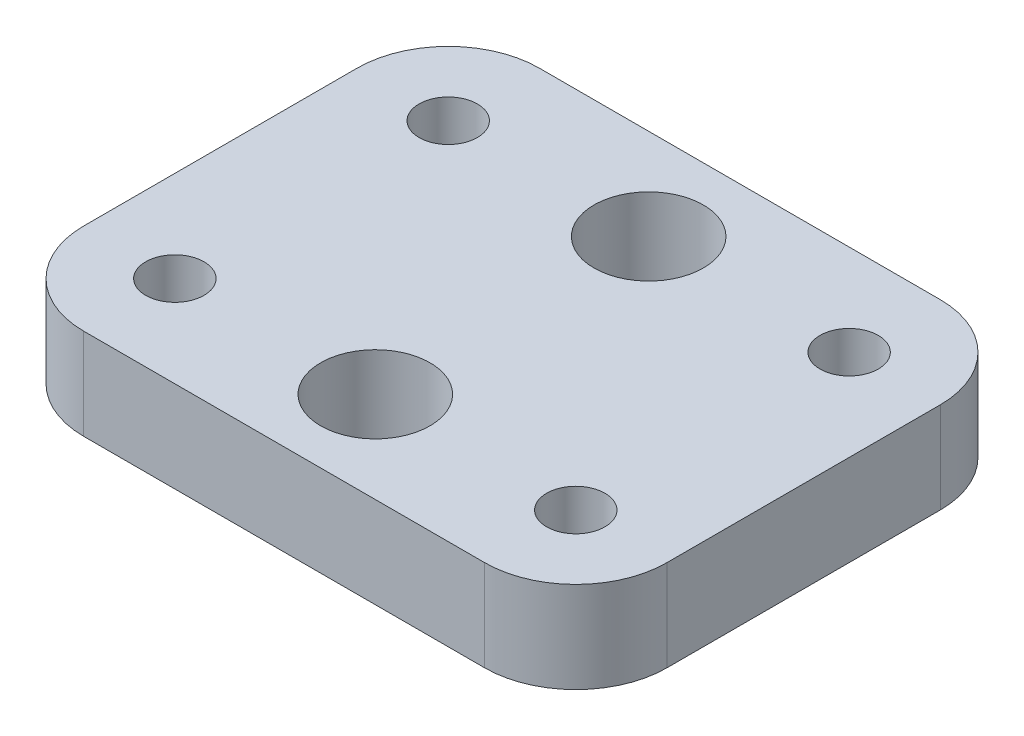
ISO-10303-21;
HEADER;
FILE_DESCRIPTION(('STEP AP214'),'2;1');
FILE_NAME('part.step','',(''),(''),'','','');
FILE_SCHEMA(('AUTOMOTIVE_DESIGN { 1 0 10303 214 1 1 1 1 }'));
ENDSEC;
DATA;
#1=APPLICATION_CONTEXT('core data for automotive mechanical design processes');
#2=APPLICATION_PROTOCOL_DEFINITION('international standard','automotive_design',2000,#1);
#3=PRODUCT_CONTEXT('',#1,'mechanical');
#4=PRODUCT('Part','Part','',(#3));
#5=PRODUCT_RELATED_PRODUCT_CATEGORY('part','',(#4));
#6=PRODUCT_DEFINITION_FORMATION('','',#4);
#7=PRODUCT_DEFINITION_CONTEXT('part definition',#1,'design');
#8=PRODUCT_DEFINITION('design','',#6,#7);
#9=PRODUCT_DEFINITION_SHAPE('','',#8);
#10=(LENGTH_UNIT() NAMED_UNIT(*) SI_UNIT(.MILLI.,.METRE.));
#11=(NAMED_UNIT(*) PLANE_ANGLE_UNIT() SI_UNIT($,.RADIAN.));
#12=(NAMED_UNIT(*) SI_UNIT($,.STERADIAN.) SOLID_ANGLE_UNIT());
#13=UNCERTAINTY_MEASURE_WITH_UNIT(LENGTH_MEASURE(1.E-05),#10,'distance_accuracy_value','');
#14=(GEOMETRIC_REPRESENTATION_CONTEXT(3) GLOBAL_UNCERTAINTY_ASSIGNED_CONTEXT((#13)) GLOBAL_UNIT_ASSIGNED_CONTEXT((#10,
#11,#12)) REPRESENTATION_CONTEXT('',''));
#15=CARTESIAN_POINT('',(0.,0.,0.));
#16=DIRECTION('',(0.,0.,1.));
#17=DIRECTION('',(1.,0.,0.));
#18=AXIS2_PLACEMENT_3D('',#15,#16,#17);
#19=CARTESIAN_POINT('',(0.,18.,0.));
#20=DIRECTION('',(0.,0.,-1.));
#21=DIRECTION('',(-1.,0.,0.));
#22=AXIS2_PLACEMENT_3D('',#19,#20,#21);
#23=PLANE('',#22);
#24=DIRECTION('',(0.,-1.,0.));
#25=VECTOR('',#24,1.);
#26=CARTESIAN_POINT('',(5.,0.,0.));
#27=LINE('',#26,#25);
#28=CARTESIAN_POINT('',(5.,19.,0.));
#29=VERTEX_POINT('',#28);
#30=CARTESIAN_POINT('',(5.,14.,0.));
#31=VERTEX_POINT('',#30);
#32=EDGE_CURVE('E50',#29,#31,#27,.T.);
#33=ORIENTED_EDGE('',*,*,#32,.T.);
#34=DIRECTION('',(1.,0.,0.));
#35=VECTOR('',#34,1.);
#36=CARTESIAN_POINT('',(0.,14.,0.));
#37=LINE('',#36,#35);
#38=CARTESIAN_POINT('',(27.,14.,0.));
#39=VERTEX_POINT('',#38);
#40=EDGE_CURVE('E113',#31,#39,#37,.T.);
#41=ORIENTED_EDGE('',*,*,#40,.T.);
#42=DIRECTION('',(0.,-1.,0.));
#43=VECTOR('',#42,1.);
#44=CARTESIAN_POINT('',(27.,18.,0.));
#45=LINE('',#44,#43);
#46=CARTESIAN_POINT('',(27.,19.,0.));
#47=VERTEX_POINT('',#46);
#48=EDGE_CURVE('E11',#39,#47,#45,.F.);
#49=ORIENTED_EDGE('',*,*,#48,.T.);
#50=DIRECTION('',(1.,0.,0.));
#51=VECTOR('',#50,1.);
#52=CARTESIAN_POINT('',(0.,19.,0.));
#53=LINE('',#52,#51);
#54=EDGE_CURVE('E132',#29,#47,#53,.T.);
#55=ORIENTED_EDGE('',*,*,#54,.F.);
#56=EDGE_LOOP('',(#33,#41,#49,#55));
#57=FACE_BOUND('',#56,.T.);
#58=ADVANCED_FACE('F40',(#57),#23,.F.);
#59=CARTESIAN_POINT('',(0.,19.,0.));
#60=DIRECTION('',(0.,-1.,0.));
#61=DIRECTION('',(0.,0.,-1.));
#62=AXIS2_PLACEMENT_3D('',#59,#60,#61);
#63=PLANE('',#62);
#64=CARTESIAN_POINT('',(16.,19.,-20.));
#65=DIRECTION('',(0.,1.,0.));
#66=DIRECTION('',(0.,0.,1.));
#67=AXIS2_PLACEMENT_3D('',#64,#65,#66);
#68=CIRCLE('',#67,3.);
#69=CARTESIAN_POINT('',(16.,19.,-17.));
#70=VERTEX_POINT('',#69);
#71=EDGE_CURVE('E168',#70,#70,#68,.T.);
#72=ORIENTED_EDGE('',*,*,#71,.F.);
#73=EDGE_LOOP('',(#72));
#74=FACE_BOUND('',#73,.T.);
#75=CARTESIAN_POINT('',(16.,19.,-5.));
#76=DIRECTION('',(0.,1.,0.));
#77=DIRECTION('',(0.,0.,1.));
#78=AXIS2_PLACEMENT_3D('',#75,#76,#77);
#79=CIRCLE('',#78,3.);
#80=CARTESIAN_POINT('',(16.,19.,-2.));
#81=VERTEX_POINT('',#80);
#82=EDGE_CURVE('E176',#81,#81,#79,.T.);
#83=ORIENTED_EDGE('',*,*,#82,.F.);
#84=EDGE_LOOP('',(#83));
#85=FACE_BOUND('',#84,.T.);
#86=CARTESIAN_POINT('',(27.,19.,-20.));
#87=DIRECTION('',(0.,1.,0.));
#88=DIRECTION('',(0.,0.,1.));
#89=AXIS2_PLACEMENT_3D('',#86,#87,#88);
#90=CIRCLE('',#89,1.6);
#91=CARTESIAN_POINT('',(27.,19.,-18.4));
#92=VERTEX_POINT('',#91);
#93=EDGE_CURVE('E174',#92,#92,#90,.T.);
#94=ORIENTED_EDGE('',*,*,#93,.F.);
#95=EDGE_LOOP('',(#94));
#96=FACE_BOUND('',#95,.T.);
#97=CARTESIAN_POINT('',(27.,19.,-5.));
#98=DIRECTION('',(0.,1.,0.));
#99=DIRECTION('',(0.,0.,1.));
#100=AXIS2_PLACEMENT_3D('',#97,#98,#99);
#101=CIRCLE('',#100,1.6);
#102=CARTESIAN_POINT('',(27.,19.,-3.4));
#103=VERTEX_POINT('',#102);
#104=EDGE_CURVE('E188',#103,#103,#101,.T.);
#105=ORIENTED_EDGE('',*,*,#104,.F.);
#106=EDGE_LOOP('',(#105));
#107=FACE_BOUND('',#106,.T.);
#108=CARTESIAN_POINT('',(5.,19.,-5.));
#109=DIRECTION('',(0.,1.,0.));
#110=DIRECTION('',(0.,0.,1.));
#111=AXIS2_PLACEMENT_3D('',#108,#109,#110);
#112=CIRCLE('',#111,1.6);
#113=CARTESIAN_POINT('',(5.,19.,-3.4));
#114=VERTEX_POINT('',#113);
#115=EDGE_CURVE('E184',#114,#114,#112,.T.);
#116=ORIENTED_EDGE('',*,*,#115,.F.);
#117=EDGE_LOOP('',(#116));
#118=FACE_BOUND('',#117,.T.);
#119=CARTESIAN_POINT('',(5.,19.,-20.));
#120=DIRECTION('',(0.,1.,0.));
#121=DIRECTION('',(0.,0.,1.));
#122=AXIS2_PLACEMENT_3D('',#119,#120,#121);
#123=CIRCLE('',#122,1.6);
#124=CARTESIAN_POINT('',(5.,19.,-18.4));
#125=VERTEX_POINT('',#124);
#126=EDGE_CURVE('E155',#125,#125,#123,.T.);
#127=ORIENTED_EDGE('',*,*,#126,.F.);
#128=EDGE_LOOP('',(#127));
#129=FACE_BOUND('',#128,.T.);
#130=DIRECTION('',(0.,0.,-1.));
#131=VECTOR('',#130,1.);
#132=CARTESIAN_POINT('',(0.,19.,0.));
#133=LINE('',#132,#131);
#134=CARTESIAN_POINT('',(0.,19.,-5.));
#135=VERTEX_POINT('',#134);
#136=CARTESIAN_POINT('',(0.,19.,-20.));
#137=VERTEX_POINT('',#136);
#138=EDGE_CURVE('E208',#135,#137,#133,.T.);
#139=ORIENTED_EDGE('',*,*,#138,.F.);
#140=CARTESIAN_POINT('',(5.,19.,-5.));
#141=DIRECTION('',(0.,-1.,0.));
#142=DIRECTION('',(0.,0.,-1.));
#143=AXIS2_PLACEMENT_3D('',#140,#141,#142);
#144=CIRCLE('',#143,5.);
#145=EDGE_CURVE('E63',#135,#29,#144,.F.);
#146=ORIENTED_EDGE('',*,*,#145,.T.);
#147=ORIENTED_EDGE('',*,*,#54,.T.);
#148=CARTESIAN_POINT('',(27.,19.,-5.));
#149=DIRECTION('',(0.,-1.,0.));
#150=DIRECTION('',(0.,0.,-1.));
#151=AXIS2_PLACEMENT_3D('',#148,#149,#150);
#152=CIRCLE('',#151,5.);
#153=CARTESIAN_POINT('',(32.,19.,-5.));
#154=VERTEX_POINT('',#153);
#155=EDGE_CURVE('E136',#47,#154,#152,.F.);
#156=ORIENTED_EDGE('',*,*,#155,.T.);
#157=DIRECTION('',(0.,0.,1.));
#158=VECTOR('',#157,1.);
#159=CARTESIAN_POINT('',(32.,19.,0.));
#160=LINE('',#159,#158);
#161=CARTESIAN_POINT('',(32.,19.,-20.));
#162=VERTEX_POINT('',#161);
#163=EDGE_CURVE('E203',#162,#154,#160,.T.);
#164=ORIENTED_EDGE('',*,*,#163,.F.);
#165=CARTESIAN_POINT('',(27.,19.,-20.));
#166=DIRECTION('',(0.,1.,0.));
#167=DIRECTION('',(0.,0.,1.));
#168=AXIS2_PLACEMENT_3D('',#165,#166,#167);
#169=CIRCLE('',#168,5.);
#170=CARTESIAN_POINT('',(27.,19.,-25.));
#171=VERTEX_POINT('',#170);
#172=EDGE_CURVE('E219',#162,#171,#169,.T.);
#173=ORIENTED_EDGE('',*,*,#172,.T.);
#174=DIRECTION('',(1.,0.,0.));
#175=VECTOR('',#174,1.);
#176=CARTESIAN_POINT('',(0.,19.,-25.));
#177=LINE('',#176,#175);
#178=CARTESIAN_POINT('',(5.,19.,-25.));
#179=VERTEX_POINT('',#178);
#180=EDGE_CURVE('E223',#179,#171,#177,.T.);
#181=ORIENTED_EDGE('',*,*,#180,.F.);
#182=CARTESIAN_POINT('',(5.,19.,-20.));
#183=DIRECTION('',(0.,1.,0.));
#184=DIRECTION('',(0.,0.,1.));
#185=AXIS2_PLACEMENT_3D('',#182,#183,#184);
#186=CIRCLE('',#185,5.);
#187=EDGE_CURVE('E227',#179,#137,#186,.T.);
#188=ORIENTED_EDGE('',*,*,#187,.T.);
#189=EDGE_LOOP('',(#139,#146,#147,#156,#164,#173,#181,#188));
#190=FACE_BOUND('',#189,.T.);
#191=ADVANCED_FACE('F248',(#74,#85,#96,#107,#118,#129,#190),#63,.F.);
#192=CARTESIAN_POINT('',(27.,18.,-5.));
#193=DIRECTION('',(0.,-1.,0.));
#194=DIRECTION('',(0.,0.,-1.));
#195=AXIS2_PLACEMENT_3D('',#192,#193,#194);
#196=CYLINDRICAL_SURFACE('',#195,5.);
#197=CARTESIAN_POINT('',(27.,14.,-5.));
#198=DIRECTION('',(0.,1.,0.));
#199=DIRECTION('',(0.,0.,1.));
#200=AXIS2_PLACEMENT_3D('',#197,#198,#199);
#201=CIRCLE('',#200,5.);
#202=CARTESIAN_POINT('',(32.,14.,-5.));
#203=VERTEX_POINT('',#202);
#204=EDGE_CURVE('E200',#203,#39,#201,.F.);
#205=ORIENTED_EDGE('',*,*,#204,.F.);
#206=DIRECTION('',(0.,-1.,0.));
#207=VECTOR('',#206,1.);
#208=CARTESIAN_POINT('',(32.,18.,-5.));
#209=LINE('',#208,#207);
#210=EDGE_CURVE('E138',#154,#203,#209,.T.);
#211=ORIENTED_EDGE('',*,*,#210,.F.);
#212=ORIENTED_EDGE('',*,*,#155,.F.);
#213=ORIENTED_EDGE('',*,*,#48,.F.);
#214=EDGE_LOOP('',(#205,#211,#212,#213));
#215=FACE_BOUND('',#214,.T.);
#216=ADVANCED_FACE('F262',(#215),#196,.T.);
#217=CARTESIAN_POINT('',(5.,18.,-5.));
#218=DIRECTION('',(0.,1.,0.));
#219=DIRECTION('',(0.,0.,1.));
#220=AXIS2_PLACEMENT_3D('',#217,#218,#219);
#221=CYLINDRICAL_SURFACE('',#220,5.);
#222=CARTESIAN_POINT('',(5.,14.,-5.));
#223=DIRECTION('',(0.,1.,0.));
#224=DIRECTION('',(0.,0.,1.));
#225=AXIS2_PLACEMENT_3D('',#222,#223,#224);
#226=CIRCLE('',#225,5.);
#227=CARTESIAN_POINT('',(0.,14.,-5.));
#228=VERTEX_POINT('',#227);
#229=EDGE_CURVE('E107',#31,#228,#226,.F.);
#230=ORIENTED_EDGE('',*,*,#229,.F.);
#231=ORIENTED_EDGE('',*,*,#32,.F.);
#232=ORIENTED_EDGE('',*,*,#145,.F.);
#233=DIRECTION('',(0.,-1.,0.));
#234=VECTOR('',#233,1.);
#235=CARTESIAN_POINT('',(0.,18.,-5.));
#236=LINE('',#235,#234);
#237=EDGE_CURVE('E124',#135,#228,#236,.T.);
#238=ORIENTED_EDGE('',*,*,#237,.T.);
#239=EDGE_LOOP('',(#230,#231,#232,#238));
#240=FACE_BOUND('',#239,.T.);
#241=ADVANCED_FACE('F42',(#240),#221,.T.);
#242=CARTESIAN_POINT('',(32.,14.,0.));
#243=DIRECTION('',(-1.,0.,0.));
#244=DIRECTION('',(0.,0.,1.));
#245=AXIS2_PLACEMENT_3D('',#242,#243,#244);
#246=PLANE('',#245);
#247=ORIENTED_EDGE('',*,*,#163,.T.);
#248=ORIENTED_EDGE('',*,*,#210,.T.);
#249=DIRECTION('',(0.,0.,1.));
#250=VECTOR('',#249,1.);
#251=CARTESIAN_POINT('',(32.,14.,0.));
#252=LINE('',#251,#250);
#253=CARTESIAN_POINT('',(32.,14.,-20.));
#254=VERTEX_POINT('',#253);
#255=EDGE_CURVE('E204',#254,#203,#252,.T.);
#256=ORIENTED_EDGE('',*,*,#255,.F.);
#257=DIRECTION('',(0.,1.,0.));
#258=VECTOR('',#257,1.);
#259=CARTESIAN_POINT('',(32.,14.,-20.));
#260=LINE('',#259,#258);
#261=EDGE_CURVE('E128',#254,#162,#260,.T.);
#262=ORIENTED_EDGE('',*,*,#261,.T.);
#263=EDGE_LOOP('',(#247,#248,#256,#262));
#264=FACE_BOUND('',#263,.T.);
#265=ADVANCED_FACE('F244',(#264),#246,.F.);
#266=CARTESIAN_POINT('',(0.,14.,0.));
#267=DIRECTION('',(1.,0.,0.));
#268=DIRECTION('',(0.,0.,-1.));
#269=AXIS2_PLACEMENT_3D('',#266,#267,#268);
#270=PLANE('',#269);
#271=ORIENTED_EDGE('',*,*,#138,.T.);
#272=DIRECTION('',(0.,1.,0.));
#273=VECTOR('',#272,1.);
#274=CARTESIAN_POINT('',(0.,14.,-20.));
#275=LINE('',#274,#273);
#276=CARTESIAN_POINT('',(0.,14.,-20.));
#277=VERTEX_POINT('',#276);
#278=EDGE_CURVE('E125',#277,#137,#275,.T.);
#279=ORIENTED_EDGE('',*,*,#278,.F.);
#280=DIRECTION('',(0.,0.,-1.));
#281=VECTOR('',#280,1.);
#282=CARTESIAN_POINT('',(0.,14.,0.));
#283=LINE('',#282,#281);
#284=EDGE_CURVE('E111',#228,#277,#283,.T.);
#285=ORIENTED_EDGE('',*,*,#284,.F.);
#286=ORIENTED_EDGE('',*,*,#237,.F.);
#287=EDGE_LOOP('',(#271,#279,#285,#286));
#288=FACE_BOUND('',#287,.T.);
#289=ADVANCED_FACE('F123',(#288),#270,.F.);
#290=CARTESIAN_POINT('',(5.,14.,-20.));
#291=DIRECTION('',(0.,1.,0.));
#292=DIRECTION('',(0.,0.,1.));
#293=AXIS2_PLACEMENT_3D('',#290,#291,#292);
#294=CYLINDRICAL_SURFACE('',#293,5.);
#295=ORIENTED_EDGE('',*,*,#187,.F.);
#296=DIRECTION('',(0.,1.,0.));
#297=VECTOR('',#296,1.);
#298=CARTESIAN_POINT('',(5.,14.,-25.));
#299=LINE('',#298,#297);
#300=CARTESIAN_POINT('',(5.,14.,-25.));
#301=VERTEX_POINT('',#300);
#302=EDGE_CURVE('E235',#301,#179,#299,.T.);
#303=ORIENTED_EDGE('',*,*,#302,.F.);
#304=CARTESIAN_POINT('',(5.,14.,-20.));
#305=DIRECTION('',(0.,1.,0.));
#306=DIRECTION('',(0.,0.,1.));
#307=AXIS2_PLACEMENT_3D('',#304,#305,#306);
#308=CIRCLE('',#307,5.);
#309=EDGE_CURVE('E129',#301,#277,#308,.T.);
#310=ORIENTED_EDGE('',*,*,#309,.T.);
#311=ORIENTED_EDGE('',*,*,#278,.T.);
#312=EDGE_LOOP('',(#295,#303,#310,#311));
#313=FACE_BOUND('',#312,.T.);
#314=ADVANCED_FACE('F259',(#313),#294,.T.);
#315=CARTESIAN_POINT('',(0.,14.,-25.));
#316=DIRECTION('',(0.,0.,1.));
#317=DIRECTION('',(1.,0.,0.));
#318=AXIS2_PLACEMENT_3D('',#315,#316,#317);
#319=PLANE('',#318);
#320=ORIENTED_EDGE('',*,*,#180,.T.);
#321=DIRECTION('',(0.,1.,0.));
#322=VECTOR('',#321,1.);
#323=CARTESIAN_POINT('',(27.,14.,-25.));
#324=LINE('',#323,#322);
#325=CARTESIAN_POINT('',(27.,14.,-25.));
#326=VERTEX_POINT('',#325);
#327=EDGE_CURVE('E238',#326,#171,#324,.T.);
#328=ORIENTED_EDGE('',*,*,#327,.F.);
#329=DIRECTION('',(1.,0.,0.));
#330=VECTOR('',#329,1.);
#331=CARTESIAN_POINT('',(0.,14.,-25.));
#332=LINE('',#331,#330);
#333=EDGE_CURVE('E212',#301,#326,#332,.T.);
#334=ORIENTED_EDGE('',*,*,#333,.F.);
#335=ORIENTED_EDGE('',*,*,#302,.T.);
#336=EDGE_LOOP('',(#320,#328,#334,#335));
#337=FACE_BOUND('',#336,.T.);
#338=ADVANCED_FACE('F256',(#337),#319,.F.);
#339=CARTESIAN_POINT('',(27.,14.,-20.));
#340=DIRECTION('',(0.,1.,0.));
#341=DIRECTION('',(0.,0.,1.));
#342=AXIS2_PLACEMENT_3D('',#339,#340,#341);
#343=CYLINDRICAL_SURFACE('',#342,5.);
#344=ORIENTED_EDGE('',*,*,#172,.F.);
#345=ORIENTED_EDGE('',*,*,#261,.F.);
#346=CARTESIAN_POINT('',(27.,14.,-20.));
#347=DIRECTION('',(0.,1.,0.));
#348=DIRECTION('',(0.,0.,1.));
#349=AXIS2_PLACEMENT_3D('',#346,#347,#348);
#350=CIRCLE('',#349,5.);
#351=EDGE_CURVE('E207',#254,#326,#350,.T.);
#352=ORIENTED_EDGE('',*,*,#351,.T.);
#353=ORIENTED_EDGE('',*,*,#327,.T.);
#354=EDGE_LOOP('',(#344,#345,#352,#353));
#355=FACE_BOUND('',#354,.T.);
#356=ADVANCED_FACE('F252',(#355),#343,.T.);
#357=CARTESIAN_POINT('',(0.,14.,0.));
#358=DIRECTION('',(0.,1.,0.));
#359=DIRECTION('',(0.,0.,1.));
#360=AXIS2_PLACEMENT_3D('',#357,#358,#359);
#361=PLANE('',#360);
#362=CARTESIAN_POINT('',(16.,14.,-20.));
#363=DIRECTION('',(0.,1.,0.));
#364=DIRECTION('',(0.,0.,1.));
#365=AXIS2_PLACEMENT_3D('',#362,#363,#364);
#366=CIRCLE('',#365,3.);
#367=CARTESIAN_POINT('',(16.,14.,-17.));
#368=VERTEX_POINT('',#367);
#369=EDGE_CURVE('E44',#368,#368,#366,.T.);
#370=ORIENTED_EDGE('',*,*,#369,.T.);
#371=EDGE_LOOP('',(#370));
#372=FACE_BOUND('',#371,.T.);
#373=CARTESIAN_POINT('',(16.,14.,-5.));
#374=DIRECTION('',(0.,1.,0.));
#375=DIRECTION('',(0.,0.,1.));
#376=AXIS2_PLACEMENT_3D('',#373,#374,#375);
#377=CIRCLE('',#376,3.);
#378=CARTESIAN_POINT('',(16.,14.,-2.));
#379=VERTEX_POINT('',#378);
#380=EDGE_CURVE('E165',#379,#379,#377,.T.);
#381=ORIENTED_EDGE('',*,*,#380,.T.);
#382=EDGE_LOOP('',(#381));
#383=FACE_BOUND('',#382,.T.);
#384=CARTESIAN_POINT('',(27.,14.,-20.));
#385=DIRECTION('',(0.,1.,0.));
#386=DIRECTION('',(0.,0.,1.));
#387=AXIS2_PLACEMENT_3D('',#384,#385,#386);
#388=CIRCLE('',#387,1.6);
#389=CARTESIAN_POINT('',(27.,14.,-18.4));
#390=VERTEX_POINT('',#389);
#391=EDGE_CURVE('E119',#390,#390,#388,.T.);
#392=ORIENTED_EDGE('',*,*,#391,.T.);
#393=EDGE_LOOP('',(#392));
#394=FACE_BOUND('',#393,.T.);
#395=CARTESIAN_POINT('',(27.,14.,-5.));
#396=DIRECTION('',(0.,1.,0.));
#397=DIRECTION('',(0.,0.,1.));
#398=AXIS2_PLACEMENT_3D('',#395,#396,#397);
#399=CIRCLE('',#398,1.6);
#400=CARTESIAN_POINT('',(27.,14.,-3.4));
#401=VERTEX_POINT('',#400);
#402=EDGE_CURVE('E159',#401,#401,#399,.T.);
#403=ORIENTED_EDGE('',*,*,#402,.T.);
#404=EDGE_LOOP('',(#403));
#405=FACE_BOUND('',#404,.T.);
#406=CARTESIAN_POINT('',(5.,14.,-5.));
#407=DIRECTION('',(0.,1.,0.));
#408=DIRECTION('',(0.,0.,1.));
#409=AXIS2_PLACEMENT_3D('',#406,#407,#408);
#410=CIRCLE('',#409,1.6);
#411=CARTESIAN_POINT('',(5.,14.,-3.4));
#412=VERTEX_POINT('',#411);
#413=EDGE_CURVE('E154',#412,#412,#410,.T.);
#414=ORIENTED_EDGE('',*,*,#413,.T.);
#415=EDGE_LOOP('',(#414));
#416=FACE_BOUND('',#415,.T.);
#417=CARTESIAN_POINT('',(5.,14.,-20.));
#418=DIRECTION('',(0.,1.,0.));
#419=DIRECTION('',(0.,0.,1.));
#420=AXIS2_PLACEMENT_3D('',#417,#418,#419);
#421=CIRCLE('',#420,1.6);
#422=CARTESIAN_POINT('',(5.,14.,-18.4));
#423=VERTEX_POINT('',#422);
#424=EDGE_CURVE('E150',#423,#423,#421,.T.);
#425=ORIENTED_EDGE('',*,*,#424,.T.);
#426=EDGE_LOOP('',(#425));
#427=FACE_BOUND('',#426,.T.);
#428=ORIENTED_EDGE('',*,*,#229,.T.);
#429=ORIENTED_EDGE('',*,*,#284,.T.);
#430=ORIENTED_EDGE('',*,*,#309,.F.);
#431=ORIENTED_EDGE('',*,*,#333,.T.);
#432=ORIENTED_EDGE('',*,*,#351,.F.);
#433=ORIENTED_EDGE('',*,*,#255,.T.);
#434=ORIENTED_EDGE('',*,*,#204,.T.);
#435=ORIENTED_EDGE('',*,*,#40,.F.);
#436=EDGE_LOOP('',(#428,#429,#430,#431,#432,#433,#434,#435));
#437=FACE_BOUND('',#436,.T.);
#438=ADVANCED_FACE('F109',(#372,#383,#394,#405,#416,#427,#437),#361,.F.);
#439=CARTESIAN_POINT('',(5.,9.,-20.));
#440=DIRECTION('',(0.,1.,0.));
#441=DIRECTION('',(0.,0.,1.));
#442=AXIS2_PLACEMENT_3D('',#439,#440,#441);
#443=CYLINDRICAL_SURFACE('',#442,1.6);
#444=ORIENTED_EDGE('',*,*,#126,.T.);
#445=EDGE_LOOP('',(#444));
#446=FACE_BOUND('',#445,.T.);
#447=ORIENTED_EDGE('',*,*,#424,.F.);
#448=EDGE_LOOP('',(#447));
#449=FACE_BOUND('',#448,.T.);
#450=ADVANCED_FACE('F288',(#446,#449),#443,.F.);
#451=CARTESIAN_POINT('',(5.,9.,-5.));
#452=DIRECTION('',(0.,1.,0.));
#453=DIRECTION('',(0.,0.,1.));
#454=AXIS2_PLACEMENT_3D('',#451,#452,#453);
#455=CYLINDRICAL_SURFACE('',#454,1.6);
#456=ORIENTED_EDGE('',*,*,#115,.T.);
#457=EDGE_LOOP('',(#456));
#458=FACE_BOUND('',#457,.T.);
#459=ORIENTED_EDGE('',*,*,#413,.F.);
#460=EDGE_LOOP('',(#459));
#461=FACE_BOUND('',#460,.T.);
#462=ADVANCED_FACE('F292',(#458,#461),#455,.F.);
#463=CARTESIAN_POINT('',(27.,9.,-5.));
#464=DIRECTION('',(0.,1.,0.));
#465=DIRECTION('',(0.,0.,1.));
#466=AXIS2_PLACEMENT_3D('',#463,#464,#465);
#467=CYLINDRICAL_SURFACE('',#466,1.6);
#468=ORIENTED_EDGE('',*,*,#104,.T.);
#469=EDGE_LOOP('',(#468));
#470=FACE_BOUND('',#469,.T.);
#471=ORIENTED_EDGE('',*,*,#402,.F.);
#472=EDGE_LOOP('',(#471));
#473=FACE_BOUND('',#472,.T.);
#474=ADVANCED_FACE('F298',(#470,#473),#467,.F.);
#475=CARTESIAN_POINT('',(27.,9.,-20.));
#476=DIRECTION('',(0.,1.,0.));
#477=DIRECTION('',(0.,0.,1.));
#478=AXIS2_PLACEMENT_3D('',#475,#476,#477);
#479=CYLINDRICAL_SURFACE('',#478,1.6);
#480=ORIENTED_EDGE('',*,*,#93,.T.);
#481=EDGE_LOOP('',(#480));
#482=FACE_BOUND('',#481,.T.);
#483=ORIENTED_EDGE('',*,*,#391,.F.);
#484=EDGE_LOOP('',(#483));
#485=FACE_BOUND('',#484,.T.);
#486=ADVANCED_FACE('F294',(#482,#485),#479,.F.);
#487=CARTESIAN_POINT('',(16.,9.,-5.));
#488=DIRECTION('',(0.,1.,0.));
#489=DIRECTION('',(0.,0.,1.));
#490=AXIS2_PLACEMENT_3D('',#487,#488,#489);
#491=CYLINDRICAL_SURFACE('',#490,3.);
#492=ORIENTED_EDGE('',*,*,#82,.T.);
#493=EDGE_LOOP('',(#492));
#494=FACE_BOUND('',#493,.T.);
#495=ORIENTED_EDGE('',*,*,#380,.F.);
#496=EDGE_LOOP('',(#495));
#497=FACE_BOUND('',#496,.T.);
#498=ADVANCED_FACE('F297',(#494,#497),#491,.F.);
#499=CARTESIAN_POINT('',(16.,9.,-20.));
#500=DIRECTION('',(0.,1.,0.));
#501=DIRECTION('',(0.,0.,1.));
#502=AXIS2_PLACEMENT_3D('',#499,#500,#501);
#503=CYLINDRICAL_SURFACE('',#502,3.);
#504=ORIENTED_EDGE('',*,*,#71,.T.);
#505=EDGE_LOOP('',(#504));
#506=FACE_BOUND('',#505,.T.);
#507=ORIENTED_EDGE('',*,*,#369,.F.);
#508=EDGE_LOOP('',(#507));
#509=FACE_BOUND('',#508,.T.);
#510=ADVANCED_FACE('F308',(#506,#509),#503,.F.);
#511=CLOSED_SHELL('',(#58,#191,#216,#241,#265,#289,#314,#338,#356,#438,#450,#462,#474,#486,#498,#510));
#512=MANIFOLD_SOLID_BREP('B2',#511);
#513=ADVANCED_BREP_SHAPE_REPRESENTATION('',(#18,#512),#14);
#514=SHAPE_DEFINITION_REPRESENTATION(#9,#513);
ENDSEC;
END-ISO-10303-21;
